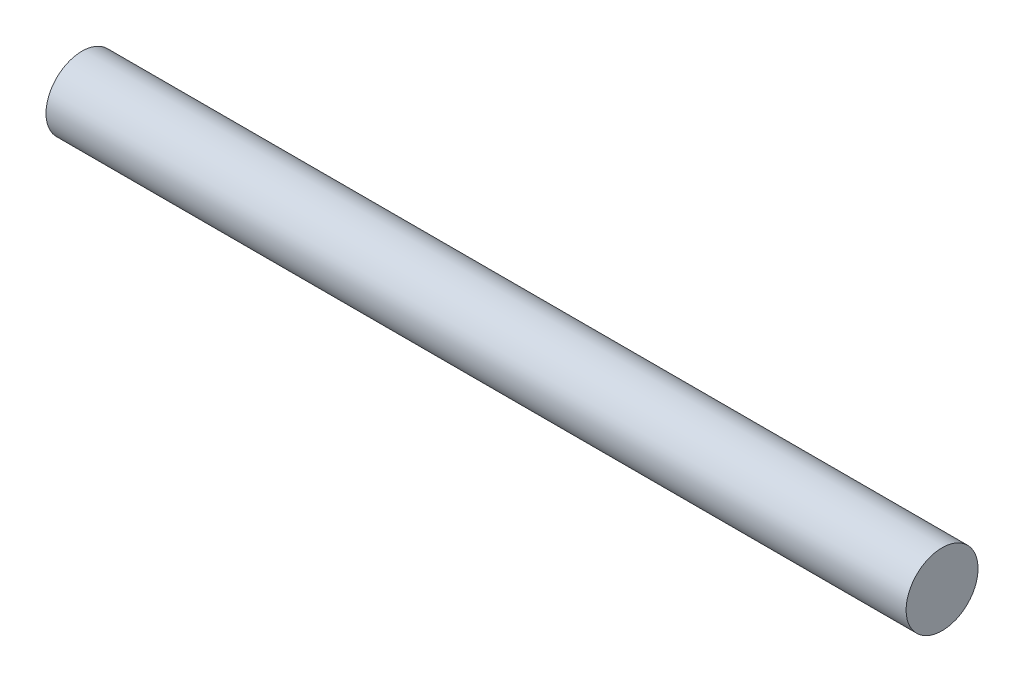
ISO-10303-21;
HEADER;
FILE_DESCRIPTION(('STEP AP214'),'2;1');
FILE_NAME('part.step','',(''),(''),'','','');
FILE_SCHEMA(('AUTOMOTIVE_DESIGN { 1 0 10303 214 1 1 1 1 }'));
ENDSEC;
DATA;
#1=APPLICATION_CONTEXT('core data for automotive mechanical design processes');
#2=APPLICATION_PROTOCOL_DEFINITION('international standard','automotive_design',2000,#1);
#3=PRODUCT_CONTEXT('',#1,'mechanical');
#4=PRODUCT('Part','Part','',(#3));
#5=PRODUCT_RELATED_PRODUCT_CATEGORY('part','',(#4));
#6=PRODUCT_DEFINITION_FORMATION('','',#4);
#7=PRODUCT_DEFINITION_CONTEXT('part definition',#1,'design');
#8=PRODUCT_DEFINITION('design','',#6,#7);
#9=PRODUCT_DEFINITION_SHAPE('','',#8);
#10=(LENGTH_UNIT() NAMED_UNIT(*) SI_UNIT(.MILLI.,.METRE.));
#11=(NAMED_UNIT(*) PLANE_ANGLE_UNIT() SI_UNIT($,.RADIAN.));
#12=(NAMED_UNIT(*) SI_UNIT($,.STERADIAN.) SOLID_ANGLE_UNIT());
#13=UNCERTAINTY_MEASURE_WITH_UNIT(LENGTH_MEASURE(1.E-05),#10,'distance_accuracy_value','');
#14=(GEOMETRIC_REPRESENTATION_CONTEXT(3) GLOBAL_UNCERTAINTY_ASSIGNED_CONTEXT((#13)) GLOBAL_UNIT_ASSIGNED_CONTEXT((#10,
#11,#12)) REPRESENTATION_CONTEXT('',''));
#15=CARTESIAN_POINT('',(0.,0.,0.));
#16=DIRECTION('',(0.,0.,1.));
#17=DIRECTION('',(1.,0.,0.));
#18=AXIS2_PLACEMENT_3D('',#15,#16,#17);
#19=CARTESIAN_POINT('',(-779.039347611489,377.335927831157,-617.65));
#20=DIRECTION('',(-1.,0.,0.));
#21=DIRECTION('',(0.,0.,1.));
#22=AXIS2_PLACEMENT_3D('',#19,#20,#21);
#23=PLANE('',#22);
#24=CARTESIAN_POINT('',(-779.039347611489,328.310927831157,-613.95));
#25=DIRECTION('',(-1.,0.,0.));
#26=DIRECTION('',(0.,0.,1.));
#27=AXIS2_PLACEMENT_3D('',#24,#25,#26);
#28=CIRCLE('',#27,36.449);
#29=CARTESIAN_POINT('',(-779.039347611489,328.310927831157,-577.501));
#30=VERTEX_POINT('',#29);
#31=EDGE_CURVE('E17',#30,#30,#28,.F.);
#32=ORIENTED_EDGE('',*,*,#31,.F.);
#33=EDGE_LOOP('',(#32));
#34=FACE_BOUND('',#33,.T.);
#35=ADVANCED_FACE('F14',(#34),#23,.T.);
#36=CARTESIAN_POINT('',(92.0606523885114,377.335927831157,-617.65));
#37=DIRECTION('',(-1.,0.,0.));
#38=DIRECTION('',(0.,0.,1.));
#39=AXIS2_PLACEMENT_3D('',#36,#37,#38);
#40=PLANE('',#39);
#41=CARTESIAN_POINT('',(92.0606523885114,328.310927831157,-613.95));
#42=DIRECTION('',(-1.,0.,0.));
#43=DIRECTION('',(0.,0.,1.));
#44=AXIS2_PLACEMENT_3D('',#41,#42,#43);
#45=CIRCLE('',#44,36.449);
#46=CARTESIAN_POINT('',(92.0606523885114,328.310927831157,-577.501));
#47=VERTEX_POINT('',#46);
#48=EDGE_CURVE('E10',#47,#47,#45,.T.);
#49=ORIENTED_EDGE('',*,*,#48,.F.);
#50=EDGE_LOOP('',(#49));
#51=FACE_BOUND('',#50,.T.);
#52=ADVANCED_FACE('F32',(#51),#40,.F.);
#53=CARTESIAN_POINT('',(432.060652388511,328.310927831157,-613.95));
#54=DIRECTION('',(-1.,0.,0.));
#55=DIRECTION('',(0.,0.,1.));
#56=AXIS2_PLACEMENT_3D('',#53,#54,#55);
#57=CYLINDRICAL_SURFACE('',#56,36.449);
#58=ORIENTED_EDGE('',*,*,#48,.T.);
#59=EDGE_LOOP('',(#58));
#60=FACE_BOUND('',#59,.T.);
#61=ORIENTED_EDGE('',*,*,#31,.T.);
#62=EDGE_LOOP('',(#61));
#63=FACE_BOUND('',#62,.T.);
#64=ADVANCED_FACE('F29',(#60,#63),#57,.T.);
#65=CLOSED_SHELL('',(#35,#52,#64));
#66=MANIFOLD_SOLID_BREP('B1',#65);
#67=ADVANCED_BREP_SHAPE_REPRESENTATION('',(#18,#66),#14);
#68=SHAPE_DEFINITION_REPRESENTATION(#9,#67);
ENDSEC;
END-ISO-10303-21;
